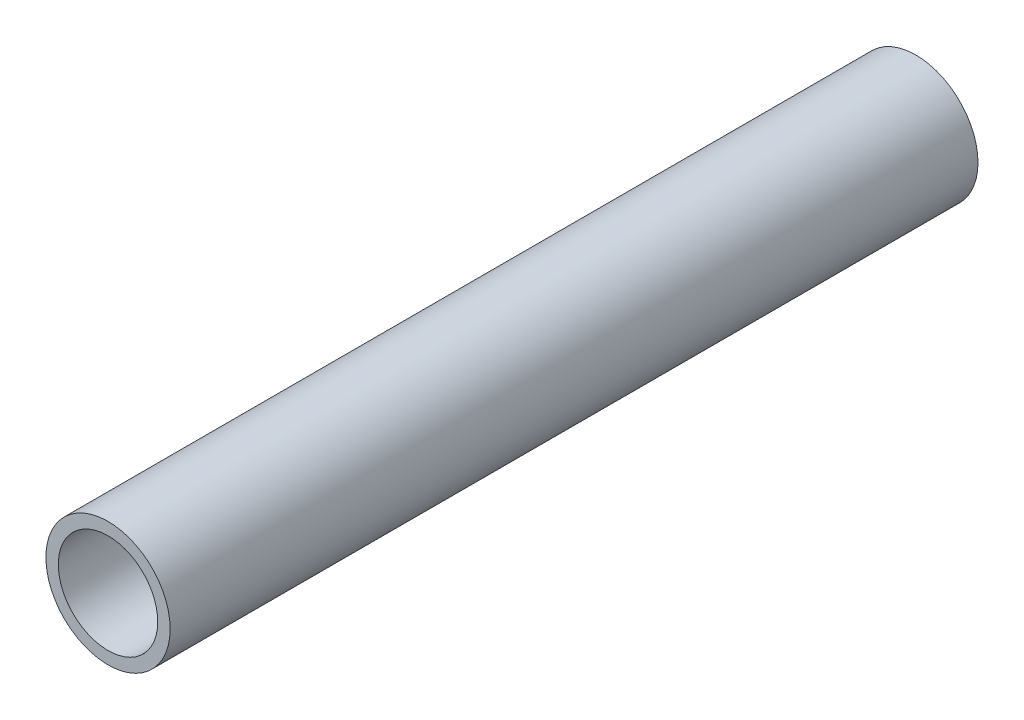
ISO-10303-21;
HEADER;
FILE_DESCRIPTION(('STEP AP214'),'2;1');
FILE_NAME('part.step','',(''),(''),'','','');
FILE_SCHEMA(('AUTOMOTIVE_DESIGN { 1 0 10303 214 1 1 1 1 }'));
ENDSEC;
DATA;
#1=APPLICATION_CONTEXT('core data for automotive mechanical design processes');
#2=APPLICATION_PROTOCOL_DEFINITION('international standard','automotive_design',2000,#1);
#3=PRODUCT_CONTEXT('',#1,'mechanical');
#4=PRODUCT('Part','Part','',(#3));
#5=PRODUCT_RELATED_PRODUCT_CATEGORY('part','',(#4));
#6=PRODUCT_DEFINITION_FORMATION('','',#4);
#7=PRODUCT_DEFINITION_CONTEXT('part definition',#1,'design');
#8=PRODUCT_DEFINITION('design','',#6,#7);
#9=PRODUCT_DEFINITION_SHAPE('','',#8);
#10=(LENGTH_UNIT() NAMED_UNIT(*) SI_UNIT(.MILLI.,.METRE.));
#11=(NAMED_UNIT(*) PLANE_ANGLE_UNIT() SI_UNIT($,.RADIAN.));
#12=(NAMED_UNIT(*) SI_UNIT($,.STERADIAN.) SOLID_ANGLE_UNIT());
#13=UNCERTAINTY_MEASURE_WITH_UNIT(LENGTH_MEASURE(1.E-05),#10,'distance_accuracy_value','');
#14=(GEOMETRIC_REPRESENTATION_CONTEXT(3) GLOBAL_UNCERTAINTY_ASSIGNED_CONTEXT((#13)) GLOBAL_UNIT_ASSIGNED_CONTEXT((#10,
#11,#12)) REPRESENTATION_CONTEXT('',''));
#15=CARTESIAN_POINT('',(0.,0.,0.));
#16=DIRECTION('',(0.,0.,1.));
#17=DIRECTION('',(1.,0.,0.));
#18=AXIS2_PLACEMENT_3D('',#15,#16,#17);
#19=CARTESIAN_POINT('',(0.,0.,65.));
#20=DIRECTION('',(0.,0.,1.));
#21=DIRECTION('',(1.,0.,0.));
#22=AXIS2_PLACEMENT_3D('',#19,#20,#21);
#23=PLANE('',#22);
#24=CARTESIAN_POINT('',(0.,0.,65.));
#25=DIRECTION('',(0.,0.,1.));
#26=DIRECTION('',(1.,0.,0.));
#27=AXIS2_PLACEMENT_3D('',#24,#25,#26);
#28=CIRCLE('',#27,5.);
#29=CARTESIAN_POINT('',(5.,0.,65.));
#30=VERTEX_POINT('',#29);
#31=EDGE_CURVE('E10',#30,#30,#28,.T.);
#32=ORIENTED_EDGE('',*,*,#31,.T.);
#33=EDGE_LOOP('',(#32));
#34=FACE_BOUND('',#33,.T.);
#35=CARTESIAN_POINT('',(0.,0.,65.));
#36=DIRECTION('',(0.,0.,1.));
#37=DIRECTION('',(1.,0.,0.));
#38=AXIS2_PLACEMENT_3D('',#35,#36,#37);
#39=CIRCLE('',#38,4.);
#40=CARTESIAN_POINT('',(4.,0.,65.));
#41=VERTEX_POINT('',#40);
#42=EDGE_CURVE('E46',#41,#41,#39,.T.);
#43=ORIENTED_EDGE('',*,*,#42,.F.);
#44=EDGE_LOOP('',(#43));
#45=FACE_BOUND('',#44,.T.);
#46=ADVANCED_FACE('F35',(#34,#45),#23,.T.);
#47=CARTESIAN_POINT('',(0.,0.,0.));
#48=DIRECTION('',(0.,0.,1.));
#49=DIRECTION('',(1.,0.,0.));
#50=AXIS2_PLACEMENT_3D('',#47,#48,#49);
#51=PLANE('',#50);
#52=CARTESIAN_POINT('',(0.,0.,0.));
#53=DIRECTION('',(0.,0.,1.));
#54=DIRECTION('',(1.,0.,0.));
#55=AXIS2_PLACEMENT_3D('',#52,#53,#54);
#56=CIRCLE('',#55,5.);
#57=CARTESIAN_POINT('',(5.,0.,0.));
#58=VERTEX_POINT('',#57);
#59=EDGE_CURVE('E39',#58,#58,#56,.T.);
#60=ORIENTED_EDGE('',*,*,#59,.F.);
#61=EDGE_LOOP('',(#60));
#62=FACE_BOUND('',#61,.T.);
#63=CARTESIAN_POINT('',(0.,0.,0.));
#64=DIRECTION('',(0.,0.,1.));
#65=DIRECTION('',(1.,0.,0.));
#66=AXIS2_PLACEMENT_3D('',#63,#64,#65);
#67=CIRCLE('',#66,4.);
#68=CARTESIAN_POINT('',(4.,0.,0.));
#69=VERTEX_POINT('',#68);
#70=EDGE_CURVE('E48',#69,#69,#67,.T.);
#71=ORIENTED_EDGE('',*,*,#70,.T.);
#72=EDGE_LOOP('',(#71));
#73=FACE_BOUND('',#72,.T.);
#74=ADVANCED_FACE('F58',(#62,#73),#51,.F.);
#75=CARTESIAN_POINT('',(0.,0.,65.));
#76=DIRECTION('',(0.,0.,-1.));
#77=DIRECTION('',(-1.,0.,0.));
#78=AXIS2_PLACEMENT_3D('',#75,#76,#77);
#79=CYLINDRICAL_SURFACE('',#78,5.);
#80=ORIENTED_EDGE('',*,*,#31,.F.);
#81=EDGE_LOOP('',(#80));
#82=FACE_BOUND('',#81,.T.);
#83=ORIENTED_EDGE('',*,*,#59,.T.);
#84=EDGE_LOOP('',(#83));
#85=FACE_BOUND('',#84,.T.);
#86=ADVANCED_FACE('F37',(#82,#85),#79,.T.);
#87=CARTESIAN_POINT('',(0.,0.,65.));
#88=DIRECTION('',(0.,0.,-1.));
#89=DIRECTION('',(-1.,0.,0.));
#90=AXIS2_PLACEMENT_3D('',#87,#88,#89);
#91=CYLINDRICAL_SURFACE('',#90,4.);
#92=ORIENTED_EDGE('',*,*,#42,.T.);
#93=EDGE_LOOP('',(#92));
#94=FACE_BOUND('',#93,.T.);
#95=ORIENTED_EDGE('',*,*,#70,.F.);
#96=EDGE_LOOP('',(#95));
#97=FACE_BOUND('',#96,.T.);
#98=ADVANCED_FACE('F54',(#94,#97),#91,.F.);
#99=CLOSED_SHELL('',(#46,#74,#86,#98));
#100=MANIFOLD_SOLID_BREP('B2',#99);
#101=ADVANCED_BREP_SHAPE_REPRESENTATION('',(#18,#100),#14);
#102=SHAPE_DEFINITION_REPRESENTATION(#9,#101);
ENDSEC;
END-ISO-10303-21;
